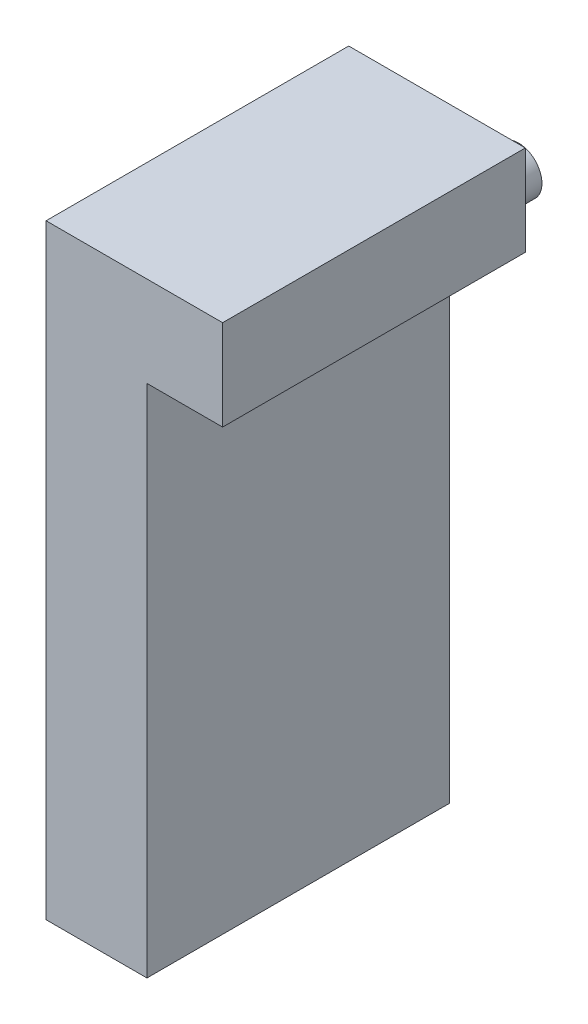
ISO-10303-21;
HEADER;
FILE_DESCRIPTION(('STEP AP214'),'2;1');
FILE_NAME('part.step','',(''),(''),'','','');
FILE_SCHEMA(('AUTOMOTIVE_DESIGN { 1 0 10303 214 1 1 1 1 }'));
ENDSEC;
DATA;
#1=APPLICATION_CONTEXT('core data for automotive mechanical design processes');
#2=APPLICATION_PROTOCOL_DEFINITION('international standard','automotive_design',2000,#1);
#3=PRODUCT_CONTEXT('',#1,'mechanical');
#4=PRODUCT('Part','Part','',(#3));
#5=PRODUCT_RELATED_PRODUCT_CATEGORY('part','',(#4));
#6=PRODUCT_DEFINITION_FORMATION('','',#4);
#7=PRODUCT_DEFINITION_CONTEXT('part definition',#1,'design');
#8=PRODUCT_DEFINITION('design','',#6,#7);
#9=PRODUCT_DEFINITION_SHAPE('','',#8);
#10=(LENGTH_UNIT() NAMED_UNIT(*) SI_UNIT(.MILLI.,.METRE.));
#11=(NAMED_UNIT(*) PLANE_ANGLE_UNIT() SI_UNIT($,.RADIAN.));
#12=(NAMED_UNIT(*) SI_UNIT($,.STERADIAN.) SOLID_ANGLE_UNIT());
#13=UNCERTAINTY_MEASURE_WITH_UNIT(LENGTH_MEASURE(1.E-05),#10,'distance_accuracy_value','');
#14=(GEOMETRIC_REPRESENTATION_CONTEXT(3) GLOBAL_UNCERTAINTY_ASSIGNED_CONTEXT((#13)) GLOBAL_UNIT_ASSIGNED_CONTEXT((#10,
#11,#12)) REPRESENTATION_CONTEXT('',''));
#15=CARTESIAN_POINT('',(0.,0.,0.));
#16=DIRECTION('',(0.,0.,1.));
#17=DIRECTION('',(1.,0.,0.));
#18=AXIS2_PLACEMENT_3D('',#15,#16,#17);
#19=CARTESIAN_POINT('',(0.,120.,0.));
#20=DIRECTION('',(-1.,0.,0.));
#21=DIRECTION('',(0.,0.,1.));
#22=AXIS2_PLACEMENT_3D('',#19,#20,#21);
#23=PLANE('',#22);
#24=DIRECTION('',(0.,0.,-1.));
#25=VECTOR('',#24,1.);
#26=CARTESIAN_POINT('',(0.,102.078212552496,0.));
#27=LINE('',#26,#25);
#28=CARTESIAN_POINT('',(0.,102.078212552496,0.));
#29=VERTEX_POINT('',#28);
#30=CARTESIAN_POINT('',(0.,102.078212552496,-60.));
#31=VERTEX_POINT('',#30);
#32=EDGE_CURVE('E61',#29,#31,#27,.T.);
#33=ORIENTED_EDGE('',*,*,#32,.F.);
#34=DIRECTION('',(0.,-1.,0.));
#35=VECTOR('',#34,1.);
#36=CARTESIAN_POINT('',(0.,120.,0.));
#37=LINE('',#36,#35);
#38=CARTESIAN_POINT('',(0.,0.,0.));
#39=VERTEX_POINT('',#38);
#40=EDGE_CURVE('E54',#29,#39,#37,.T.);
#41=ORIENTED_EDGE('',*,*,#40,.T.);
#42=DIRECTION('',(0.,0.,-1.));
#43=VECTOR('',#42,1.);
#44=CARTESIAN_POINT('',(0.,0.,0.));
#45=LINE('',#44,#43);
#46=CARTESIAN_POINT('',(0.,0.,-60.));
#47=VERTEX_POINT('',#46);
#48=EDGE_CURVE('E88',#39,#47,#45,.T.);
#49=ORIENTED_EDGE('',*,*,#48,.T.);
#50=DIRECTION('',(0.,-1.,0.));
#51=VECTOR('',#50,1.);
#52=CARTESIAN_POINT('',(0.,120.,-60.));
#53=LINE('',#52,#51);
#54=EDGE_CURVE('E95',#31,#47,#53,.T.);
#55=ORIENTED_EDGE('',*,*,#54,.F.);
#56=EDGE_LOOP('',(#33,#41,#49,#55));
#57=FACE_BOUND('',#56,.T.);
#58=ADVANCED_FACE('F45',(#57),#23,.F.);
#59=CARTESIAN_POINT('',(0.,120.,0.));
#60=DIRECTION('',(0.,0.,1.));
#61=DIRECTION('',(1.,0.,0.));
#62=AXIS2_PLACEMENT_3D('',#59,#60,#61);
#63=PLANE('',#62);
#64=DIRECTION('',(-1.,0.,0.));
#65=VECTOR('',#64,1.);
#66=CARTESIAN_POINT('',(0.,0.,0.));
#67=LINE('',#66,#65);
#68=CARTESIAN_POINT('',(-20.,0.,0.));
#69=VERTEX_POINT('',#68);
#70=EDGE_CURVE('E101',#39,#69,#67,.T.);
#71=ORIENTED_EDGE('',*,*,#70,.F.);
#72=ORIENTED_EDGE('',*,*,#40,.F.);
#73=DIRECTION('',(-1.,0.,0.));
#74=VECTOR('',#73,1.);
#75=CARTESIAN_POINT('',(15.,102.078212552496,0.));
#76=LINE('',#75,#74);
#77=CARTESIAN_POINT('',(15.,102.078212552496,0.));
#78=VERTEX_POINT('',#77);
#79=EDGE_CURVE('E112',#78,#29,#76,.T.);
#80=ORIENTED_EDGE('',*,*,#79,.F.);
#81=DIRECTION('',(0.,-1.,0.));
#82=VECTOR('',#81,1.);
#83=CARTESIAN_POINT('',(15.,120.,0.));
#84=LINE('',#83,#82);
#85=CARTESIAN_POINT('',(15.,120.,0.));
#86=VERTEX_POINT('',#85);
#87=EDGE_CURVE('E143',#86,#78,#84,.T.);
#88=ORIENTED_EDGE('',*,*,#87,.F.);
#89=DIRECTION('',(-1.,0.,0.));
#90=VECTOR('',#89,1.);
#91=CARTESIAN_POINT('',(0.,120.,0.));
#92=LINE('',#91,#90);
#93=CARTESIAN_POINT('',(-20.,120.,0.));
#94=VERTEX_POINT('',#93);
#95=EDGE_CURVE('E105',#86,#94,#92,.T.);
#96=ORIENTED_EDGE('',*,*,#95,.T.);
#97=DIRECTION('',(0.,-1.,0.));
#98=VECTOR('',#97,1.);
#99=CARTESIAN_POINT('',(-20.,120.,0.));
#100=LINE('',#99,#98);
#101=EDGE_CURVE('E108',#94,#69,#100,.T.);
#102=ORIENTED_EDGE('',*,*,#101,.T.);
#103=EDGE_LOOP('',(#71,#72,#80,#88,#96,#102));
#104=FACE_BOUND('',#103,.T.);
#105=ADVANCED_FACE('F47',(#104),#63,.T.);
#106=CARTESIAN_POINT('',(0.,120.,-60.));
#107=DIRECTION('',(0.,0.,1.));
#108=DIRECTION('',(1.,0.,0.));
#109=AXIS2_PLACEMENT_3D('',#106,#107,#108);
#110=PLANE('',#109);
#111=CARTESIAN_POINT('',(8.67268084057926,110.561152870212,-60.));
#112=DIRECTION('',(0.,0.,1.));
#113=DIRECTION('',(1.,0.,0.));
#114=AXIS2_PLACEMENT_3D('',#111,#112,#113);
#115=CIRCLE('',#114,4.625);
#116=CARTESIAN_POINT('',(13.2976808405793,110.561152870212,-60.));
#117=VERTEX_POINT('',#116);
#118=EDGE_CURVE('E11',#117,#117,#115,.F.);
#119=ORIENTED_EDGE('',*,*,#118,.F.);
#120=EDGE_LOOP('',(#119));
#121=FACE_BOUND('',#120,.T.);
#122=DIRECTION('',(-1.,0.,0.));
#123=VECTOR('',#122,1.);
#124=CARTESIAN_POINT('',(0.,0.,-60.));
#125=LINE('',#124,#123);
#126=CARTESIAN_POINT('',(-20.,0.,-60.));
#127=VERTEX_POINT('',#126);
#128=EDGE_CURVE('E103',#47,#127,#125,.T.);
#129=ORIENTED_EDGE('',*,*,#128,.T.);
#130=DIRECTION('',(0.,-1.,0.));
#131=VECTOR('',#130,1.);
#132=CARTESIAN_POINT('',(-20.,120.,-60.));
#133=LINE('',#132,#131);
#134=CARTESIAN_POINT('',(-20.,120.,-60.));
#135=VERTEX_POINT('',#134);
#136=EDGE_CURVE('E126',#135,#127,#133,.T.);
#137=ORIENTED_EDGE('',*,*,#136,.F.);
#138=DIRECTION('',(-1.,0.,0.));
#139=VECTOR('',#138,1.);
#140=CARTESIAN_POINT('',(0.,120.,-60.));
#141=LINE('',#140,#139);
#142=CARTESIAN_POINT('',(15.,120.,-60.));
#143=VERTEX_POINT('',#142);
#144=EDGE_CURVE('E70',#143,#135,#141,.T.);
#145=ORIENTED_EDGE('',*,*,#144,.F.);
#146=DIRECTION('',(0.,1.,0.));
#147=VECTOR('',#146,1.);
#148=CARTESIAN_POINT('',(15.,120.,-60.));
#149=LINE('',#148,#147);
#150=CARTESIAN_POINT('',(15.,102.078212552496,-60.));
#151=VERTEX_POINT('',#150);
#152=EDGE_CURVE('E148',#151,#143,#149,.T.);
#153=ORIENTED_EDGE('',*,*,#152,.F.);
#154=DIRECTION('',(-1.,0.,0.));
#155=VECTOR('',#154,1.);
#156=CARTESIAN_POINT('',(15.,102.078212552496,-60.));
#157=LINE('',#156,#155);
#158=EDGE_CURVE('E117',#151,#31,#157,.T.);
#159=ORIENTED_EDGE('',*,*,#158,.T.);
#160=ORIENTED_EDGE('',*,*,#54,.T.);
#161=EDGE_LOOP('',(#129,#137,#145,#153,#159,#160));
#162=FACE_BOUND('',#161,.T.);
#163=ADVANCED_FACE('F172',(#121,#162),#110,.F.);
#164=CARTESIAN_POINT('',(-20.,120.,0.));
#165=DIRECTION('',(-1.,0.,0.));
#166=DIRECTION('',(0.,0.,1.));
#167=AXIS2_PLACEMENT_3D('',#164,#165,#166);
#168=PLANE('',#167);
#169=DIRECTION('',(0.,0.,-1.));
#170=VECTOR('',#169,1.);
#171=CARTESIAN_POINT('',(-20.,0.,0.));
#172=LINE('',#171,#170);
#173=EDGE_CURVE('E111',#69,#127,#172,.T.);
#174=ORIENTED_EDGE('',*,*,#173,.F.);
#175=ORIENTED_EDGE('',*,*,#101,.F.);
#176=DIRECTION('',(0.,0.,-1.));
#177=VECTOR('',#176,1.);
#178=CARTESIAN_POINT('',(-20.,120.,0.));
#179=LINE('',#178,#177);
#180=EDGE_CURVE('E130',#94,#135,#179,.T.);
#181=ORIENTED_EDGE('',*,*,#180,.T.);
#182=ORIENTED_EDGE('',*,*,#136,.T.);
#183=EDGE_LOOP('',(#174,#175,#181,#182));
#184=FACE_BOUND('',#183,.T.);
#185=ADVANCED_FACE('F175',(#184),#168,.T.);
#186=CARTESIAN_POINT('',(0.,120.,0.));
#187=DIRECTION('',(0.,-1.,0.));
#188=DIRECTION('',(0.,0.,-1.));
#189=AXIS2_PLACEMENT_3D('',#186,#187,#188);
#190=PLANE('',#189);
#191=ORIENTED_EDGE('',*,*,#95,.F.);
#192=DIRECTION('',(0.,0.,1.));
#193=VECTOR('',#192,1.);
#194=CARTESIAN_POINT('',(15.,120.,0.));
#195=LINE('',#194,#193);
#196=EDGE_CURVE('E140',#143,#86,#195,.T.);
#197=ORIENTED_EDGE('',*,*,#196,.F.);
#198=ORIENTED_EDGE('',*,*,#144,.T.);
#199=ORIENTED_EDGE('',*,*,#180,.F.);
#200=EDGE_LOOP('',(#191,#197,#198,#199));
#201=FACE_BOUND('',#200,.T.);
#202=ADVANCED_FACE('F178',(#201),#190,.F.);
#203=CARTESIAN_POINT('',(0.,0.,0.));
#204=DIRECTION('',(0.,-1.,0.));
#205=DIRECTION('',(0.,0.,-1.));
#206=AXIS2_PLACEMENT_3D('',#203,#204,#205);
#207=PLANE('',#206);
#208=ORIENTED_EDGE('',*,*,#70,.T.);
#209=ORIENTED_EDGE('',*,*,#173,.T.);
#210=ORIENTED_EDGE('',*,*,#128,.F.);
#211=ORIENTED_EDGE('',*,*,#48,.F.);
#212=EDGE_LOOP('',(#208,#209,#210,#211));
#213=FACE_BOUND('',#212,.T.);
#214=ADVANCED_FACE('F99',(#213),#207,.T.);
#215=CARTESIAN_POINT('',(15.,102.078212552496,0.));
#216=DIRECTION('',(0.,1.,0.));
#217=DIRECTION('',(0.,0.,1.));
#218=AXIS2_PLACEMENT_3D('',#215,#216,#217);
#219=PLANE('',#218);
#220=ORIENTED_EDGE('',*,*,#32,.T.);
#221=ORIENTED_EDGE('',*,*,#158,.F.);
#222=DIRECTION('',(0.,0.,-1.));
#223=VECTOR('',#222,1.);
#224=CARTESIAN_POINT('',(15.,102.078212552496,0.));
#225=LINE('',#224,#223);
#226=EDGE_CURVE('E152',#78,#151,#225,.T.);
#227=ORIENTED_EDGE('',*,*,#226,.F.);
#228=ORIENTED_EDGE('',*,*,#79,.T.);
#229=EDGE_LOOP('',(#220,#221,#227,#228));
#230=FACE_BOUND('',#229,.T.);
#231=ADVANCED_FACE('F193',(#230),#219,.F.);
#232=CARTESIAN_POINT('',(15.,0.,0.));
#233=DIRECTION('',(1.,0.,0.));
#234=DIRECTION('',(0.,0.,-1.));
#235=AXIS2_PLACEMENT_3D('',#232,#233,#234);
#236=PLANE('',#235);
#237=ORIENTED_EDGE('',*,*,#87,.T.);
#238=ORIENTED_EDGE('',*,*,#226,.T.);
#239=ORIENTED_EDGE('',*,*,#152,.T.);
#240=ORIENTED_EDGE('',*,*,#196,.T.);
#241=EDGE_LOOP('',(#237,#238,#239,#240));
#242=FACE_BOUND('',#241,.T.);
#243=ADVANCED_FACE('F168',(#242),#236,.T.);
#244=CARTESIAN_POINT('',(8.67268084057926,110.561152870212,-65.));
#245=DIRECTION('',(0.,0.,1.));
#246=DIRECTION('',(1.,0.,0.));
#247=AXIS2_PLACEMENT_3D('',#244,#245,#246);
#248=CYLINDRICAL_SURFACE('',#247,4.625);
#249=CARTESIAN_POINT('',(8.67268084057926,110.561152870212,-65.));
#250=DIRECTION('',(0.,0.,-1.));
#251=DIRECTION('',(-1.,0.,0.));
#252=AXIS2_PLACEMENT_3D('',#249,#250,#251);
#253=CIRCLE('',#252,4.625);
#254=CARTESIAN_POINT('',(4.04768084057926,110.561152870212,-65.));
#255=VERTEX_POINT('',#254);
#256=EDGE_CURVE('E144',#255,#255,#253,.T.);
#257=ORIENTED_EDGE('',*,*,#256,.F.);
#258=EDGE_LOOP('',(#257));
#259=FACE_BOUND('',#258,.T.);
#260=ORIENTED_EDGE('',*,*,#118,.T.);
#261=EDGE_LOOP('',(#260));
#262=FACE_BOUND('',#261,.T.);
#263=ADVANCED_FACE('F165',(#259,#262),#248,.T.);
#264=CARTESIAN_POINT('',(8.67268084057926,110.561152870212,-65.));
#265=DIRECTION('',(0.,0.,-1.));
#266=DIRECTION('',(-1.,0.,0.));
#267=AXIS2_PLACEMENT_3D('',#264,#265,#266);
#268=PLANE('',#267);
#269=ORIENTED_EDGE('',*,*,#256,.T.);
#270=EDGE_LOOP('',(#269));
#271=FACE_BOUND('',#270,.T.);
#272=ADVANCED_FACE('F163',(#271),#268,.T.);
#273=CLOSED_SHELL('',(#58,#105,#163,#185,#202,#214,#231,#243,#263,#272));
#274=MANIFOLD_SOLID_BREP('B2',#273);
#275=ADVANCED_BREP_SHAPE_REPRESENTATION('',(#18,#274),#14);
#276=SHAPE_DEFINITION_REPRESENTATION(#9,#275);
ENDSEC;
END-ISO-10303-21;
